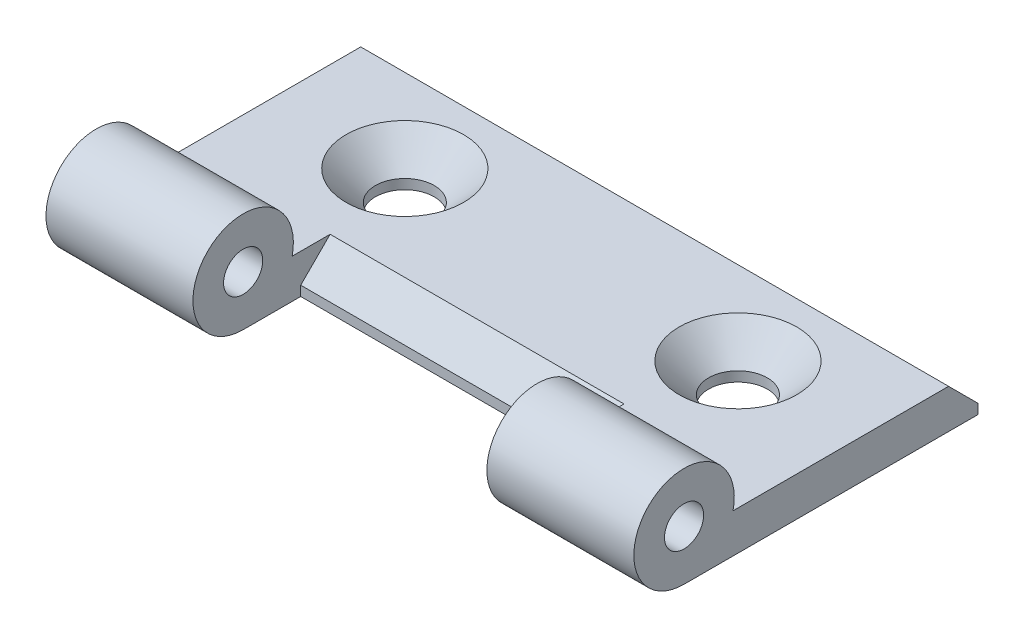
ISO-10303-21;
HEADER;
FILE_DESCRIPTION(('STEP AP214'),'2;1');
FILE_NAME('part.step','',(''),(''),'','','');
FILE_SCHEMA(('AUTOMOTIVE_DESIGN { 1 0 10303 214 1 1 1 1 }'));
ENDSEC;
DATA;
#1=APPLICATION_CONTEXT('core data for automotive mechanical design processes');
#2=APPLICATION_PROTOCOL_DEFINITION('international standard','automotive_design',2000,#1);
#3=PRODUCT_CONTEXT('',#1,'mechanical');
#4=PRODUCT('Part','Part','',(#3));
#5=PRODUCT_RELATED_PRODUCT_CATEGORY('part','',(#4));
#6=PRODUCT_DEFINITION_FORMATION('','',#4);
#7=PRODUCT_DEFINITION_CONTEXT('part definition',#1,'design');
#8=PRODUCT_DEFINITION('design','',#6,#7);
#9=PRODUCT_DEFINITION_SHAPE('','',#8);
#10=(LENGTH_UNIT() NAMED_UNIT(*) SI_UNIT(.MILLI.,.METRE.));
#11=(NAMED_UNIT(*) PLANE_ANGLE_UNIT() SI_UNIT($,.RADIAN.));
#12=(NAMED_UNIT(*) SI_UNIT($,.STERADIAN.) SOLID_ANGLE_UNIT());
#13=UNCERTAINTY_MEASURE_WITH_UNIT(LENGTH_MEASURE(1.E-05),#10,'distance_accuracy_value','');
#14=(GEOMETRIC_REPRESENTATION_CONTEXT(3) GLOBAL_UNCERTAINTY_ASSIGNED_CONTEXT((#13)) GLOBAL_UNIT_ASSIGNED_CONTEXT((#10,
#11,#12)) REPRESENTATION_CONTEXT('',''));
#15=CARTESIAN_POINT('',(0.,0.,0.));
#16=DIRECTION('',(0.,0.,1.));
#17=DIRECTION('',(1.,0.,0.));
#18=AXIS2_PLACEMENT_3D('',#15,#16,#17);
#19=CARTESIAN_POINT('',(30.,5.125,0.));
#20=DIRECTION('',(-1.,0.,0.));
#21=DIRECTION('',(0.,0.,1.));
#22=AXIS2_PLACEMENT_3D('',#19,#20,#21);
#23=CYLINDRICAL_SURFACE('',#22,5.125);
#24=CARTESIAN_POINT('',(-15.,5.125,0.));
#25=DIRECTION('',(1.,0.,0.));
#26=DIRECTION('',(0.,0.,-1.));
#27=AXIS2_PLACEMENT_3D('',#24,#25,#26);
#28=CIRCLE('',#27,5.125);
#29=CARTESIAN_POINT('',(-15.,4.,-5.));
#30=VERTEX_POINT('',#29);
#31=CARTESIAN_POINT('',(-15.,0.,0.));
#32=VERTEX_POINT('',#31);
#33=EDGE_CURVE('E159',#30,#32,#28,.T.);
#34=ORIENTED_EDGE('',*,*,#33,.F.);
#35=DIRECTION('',(-1.,0.,0.));
#36=VECTOR('',#35,1.);
#37=CARTESIAN_POINT('',(30.,4.,-5.));
#38=LINE('',#37,#36);
#39=CARTESIAN_POINT('',(-30.,4.,-5.));
#40=VERTEX_POINT('',#39);
#41=EDGE_CURVE('E178',#30,#40,#38,.T.);
#42=ORIENTED_EDGE('',*,*,#41,.T.);
#43=CARTESIAN_POINT('',(-30.,5.125,0.));
#44=DIRECTION('',(1.,0.,0.));
#45=DIRECTION('',(0.,0.,-1.));
#46=AXIS2_PLACEMENT_3D('',#43,#44,#45);
#47=CIRCLE('',#46,5.125);
#48=CARTESIAN_POINT('',(-30.,0.,0.));
#49=VERTEX_POINT('',#48);
#50=EDGE_CURVE('E165',#40,#49,#47,.T.);
#51=ORIENTED_EDGE('',*,*,#50,.T.);
#52=DIRECTION('',(-1.,0.,0.));
#53=VECTOR('',#52,1.);
#54=CARTESIAN_POINT('',(30.,0.,0.));
#55=LINE('',#54,#53);
#56=EDGE_CURVE('E192',#32,#49,#55,.T.);
#57=ORIENTED_EDGE('',*,*,#56,.F.);
#58=EDGE_LOOP('',(#34,#42,#51,#57));
#59=FACE_BOUND('',#58,.T.);
#60=ADVANCED_FACE('F37',(#59),#23,.T.);
#61=CARTESIAN_POINT('',(30.,4.,-5.));
#62=VERTEX_POINT('',#61);
#63=CARTESIAN_POINT('',(15.,4.,-5.));
#64=VERTEX_POINT('',#63);
#65=EDGE_CURVE('E186',#62,#64,#38,.T.);
#66=ORIENTED_EDGE('',*,*,#65,.T.);
#67=CARTESIAN_POINT('',(15.,5.125,0.));
#68=DIRECTION('',(-1.,0.,0.));
#69=DIRECTION('',(0.,0.,1.));
#70=AXIS2_PLACEMENT_3D('',#67,#68,#69);
#71=CIRCLE('',#70,5.125);
#72=CARTESIAN_POINT('',(15.,0.,0.));
#73=VERTEX_POINT('',#72);
#74=EDGE_CURVE('E153',#73,#64,#71,.T.);
#75=ORIENTED_EDGE('',*,*,#74,.F.);
#76=CARTESIAN_POINT('',(30.,0.,0.));
#77=VERTEX_POINT('',#76);
#78=EDGE_CURVE('E140',#77,#73,#55,.T.);
#79=ORIENTED_EDGE('',*,*,#78,.F.);
#80=CARTESIAN_POINT('',(30.,5.125,0.));
#81=DIRECTION('',(1.,0.,0.));
#82=DIRECTION('',(0.,0.,-1.));
#83=AXIS2_PLACEMENT_3D('',#80,#81,#82);
#84=CIRCLE('',#83,5.125);
#85=EDGE_CURVE('E168',#62,#77,#84,.T.);
#86=ORIENTED_EDGE('',*,*,#85,.F.);
#87=EDGE_LOOP('',(#66,#75,#79,#86));
#88=FACE_BOUND('',#87,.T.);
#89=ADVANCED_FACE('F250',(#88),#23,.T.);
#90=CARTESIAN_POINT('',(30.,5.125,0.));
#91=DIRECTION('',(-1.,0.,0.));
#92=DIRECTION('',(0.,0.,1.));
#93=AXIS2_PLACEMENT_3D('',#90,#91,#92);
#94=CYLINDRICAL_SURFACE('',#93,2.);
#95=CARTESIAN_POINT('',(-30.,5.125,0.));
#96=DIRECTION('',(1.,0.,0.));
#97=DIRECTION('',(0.,0.,-1.));
#98=AXIS2_PLACEMENT_3D('',#95,#96,#97);
#99=CIRCLE('',#98,2.);
#100=CARTESIAN_POINT('',(-30.,5.125,-2.));
#101=VERTEX_POINT('',#100);
#102=EDGE_CURVE('E161',#101,#101,#99,.T.);
#103=ORIENTED_EDGE('',*,*,#102,.F.);
#104=EDGE_LOOP('',(#103));
#105=FACE_BOUND('',#104,.T.);
#106=CARTESIAN_POINT('',(-15.,5.125,0.));
#107=DIRECTION('',(1.,0.,0.));
#108=DIRECTION('',(0.,0.,-1.));
#109=AXIS2_PLACEMENT_3D('',#106,#107,#108);
#110=CIRCLE('',#109,2.);
#111=CARTESIAN_POINT('',(-15.,5.125,-2.));
#112=VERTEX_POINT('',#111);
#113=EDGE_CURVE('E155',#112,#112,#110,.T.);
#114=ORIENTED_EDGE('',*,*,#113,.T.);
#115=EDGE_LOOP('',(#114));
#116=FACE_BOUND('',#115,.T.);
#117=ADVANCED_FACE('F252',(#105,#116),#94,.F.);
#118=CARTESIAN_POINT('',(30.,5.125,0.));
#119=DIRECTION('',(1.,0.,0.));
#120=DIRECTION('',(0.,0.,-1.));
#121=AXIS2_PLACEMENT_3D('',#118,#119,#120);
#122=CIRCLE('',#121,2.);
#123=CARTESIAN_POINT('',(30.,5.125,-2.));
#124=VERTEX_POINT('',#123);
#125=EDGE_CURVE('E162',#124,#124,#122,.T.);
#126=ORIENTED_EDGE('',*,*,#125,.T.);
#127=EDGE_LOOP('',(#126));
#128=FACE_BOUND('',#127,.T.);
#129=CARTESIAN_POINT('',(15.,5.125,0.));
#130=DIRECTION('',(-1.,0.,0.));
#131=DIRECTION('',(0.,0.,1.));
#132=AXIS2_PLACEMENT_3D('',#129,#130,#131);
#133=CIRCLE('',#132,2.);
#134=CARTESIAN_POINT('',(15.,5.125,2.));
#135=VERTEX_POINT('',#134);
#136=EDGE_CURVE('E150',#135,#135,#133,.T.);
#137=ORIENTED_EDGE('',*,*,#136,.T.);
#138=EDGE_LOOP('',(#137));
#139=FACE_BOUND('',#138,.T.);
#140=ADVANCED_FACE('F258',(#128,#139),#94,.F.);
#141=CARTESIAN_POINT('',(30.,5.125,0.));
#142=DIRECTION('',(1.,0.,0.));
#143=DIRECTION('',(0.,0.,-1.));
#144=AXIS2_PLACEMENT_3D('',#141,#142,#143);
#145=PLANE('',#144);
#146=DIRECTION('',(0.,1.,0.));
#147=VECTOR('',#146,1.);
#148=CARTESIAN_POINT('',(30.,0.,-30.));
#149=LINE('',#148,#147);
#150=CARTESIAN_POINT('',(30.,0.,-30.));
#151=VERTEX_POINT('',#150);
#152=CARTESIAN_POINT('',(30.,0.999999999999984,-30.));
#153=VERTEX_POINT('',#152);
#154=EDGE_CURVE('E174',#151,#153,#149,.T.);
#155=ORIENTED_EDGE('',*,*,#154,.T.);
#156=DIRECTION('',(0.,-0.707106781186549,-0.707106781186546));
#157=VECTOR('',#156,1.);
#158=CARTESIAN_POINT('',(30.,18.0625,-12.9375000000001));
#159=LINE('',#158,#157);
#160=CARTESIAN_POINT('',(30.,4.,-27.));
#161=VERTEX_POINT('',#160);
#162=EDGE_CURVE('E220',#153,#161,#159,.F.);
#163=ORIENTED_EDGE('',*,*,#162,.T.);
#164=DIRECTION('',(0.,0.,1.));
#165=VECTOR('',#164,1.);
#166=CARTESIAN_POINT('',(30.,4.,-5.));
#167=LINE('',#166,#165);
#168=EDGE_CURVE('E176',#161,#62,#167,.T.);
#169=ORIENTED_EDGE('',*,*,#168,.T.);
#170=ORIENTED_EDGE('',*,*,#85,.T.);
#171=DIRECTION('',(0.,0.,-1.));
#172=VECTOR('',#171,1.);
#173=CARTESIAN_POINT('',(30.,0.,0.));
#174=LINE('',#173,#172);
#175=EDGE_CURVE('E171',#77,#151,#174,.T.);
#176=ORIENTED_EDGE('',*,*,#175,.T.);
#177=EDGE_LOOP('',(#155,#163,#169,#170,#176));
#178=FACE_BOUND('',#177,.T.);
#179=ORIENTED_EDGE('',*,*,#125,.F.);
#180=EDGE_LOOP('',(#179));
#181=FACE_BOUND('',#180,.T.);
#182=ADVANCED_FACE('F243',(#178,#181),#145,.T.);
#183=CARTESIAN_POINT('',(-30.,5.125,0.));
#184=DIRECTION('',(1.,0.,0.));
#185=DIRECTION('',(0.,0.,-1.));
#186=AXIS2_PLACEMENT_3D('',#183,#184,#185);
#187=PLANE('',#186);
#188=DIRECTION('',(0.,0.,1.));
#189=VECTOR('',#188,1.);
#190=CARTESIAN_POINT('',(-30.,4.,-5.));
#191=LINE('',#190,#189);
#192=CARTESIAN_POINT('',(-30.,4.,-27.));
#193=VERTEX_POINT('',#192);
#194=EDGE_CURVE('E172',#193,#40,#191,.T.);
#195=ORIENTED_EDGE('',*,*,#194,.F.);
#196=DIRECTION('',(0.,0.707106781186549,0.707106781186546));
#197=VECTOR('',#196,1.);
#198=CARTESIAN_POINT('',(-30.,4.,-27.));
#199=LINE('',#198,#197);
#200=CARTESIAN_POINT('',(-30.,0.999999999999984,-30.));
#201=VERTEX_POINT('',#200);
#202=EDGE_CURVE('E61',#193,#201,#199,.F.);
#203=ORIENTED_EDGE('',*,*,#202,.T.);
#204=DIRECTION('',(0.,1.,0.));
#205=VECTOR('',#204,1.);
#206=CARTESIAN_POINT('',(-30.,0.,-30.));
#207=LINE('',#206,#205);
#208=CARTESIAN_POINT('',(-30.,0.,-30.));
#209=VERTEX_POINT('',#208);
#210=EDGE_CURVE('E183',#209,#201,#207,.T.);
#211=ORIENTED_EDGE('',*,*,#210,.F.);
#212=DIRECTION('',(0.,0.,-1.));
#213=VECTOR('',#212,1.);
#214=CARTESIAN_POINT('',(-30.,0.,0.));
#215=LINE('',#214,#213);
#216=EDGE_CURVE('E181',#49,#209,#215,.T.);
#217=ORIENTED_EDGE('',*,*,#216,.F.);
#218=ORIENTED_EDGE('',*,*,#50,.F.);
#219=EDGE_LOOP('',(#195,#203,#211,#217,#218));
#220=FACE_BOUND('',#219,.T.);
#221=ORIENTED_EDGE('',*,*,#102,.T.);
#222=EDGE_LOOP('',(#221));
#223=FACE_BOUND('',#222,.T.);
#224=ADVANCED_FACE('F237',(#220,#223),#187,.F.);
#225=CARTESIAN_POINT('',(30.,0.,0.));
#226=DIRECTION('',(0.,1.,0.));
#227=DIRECTION('',(0.,0.,1.));
#228=AXIS2_PLACEMENT_3D('',#225,#226,#227);
#229=PLANE('',#228);
#230=DIRECTION('',(0.,0.,1.));
#231=VECTOR('',#230,1.);
#232=CARTESIAN_POINT('',(-15.,0.,-5.875));
#233=LINE('',#232,#231);
#234=CARTESIAN_POINT('',(-15.,0.,-5.875));
#235=VERTEX_POINT('',#234);
#236=EDGE_CURVE('E141',#235,#32,#233,.T.);
#237=ORIENTED_EDGE('',*,*,#236,.T.);
#238=ORIENTED_EDGE('',*,*,#56,.T.);
#239=ORIENTED_EDGE('',*,*,#216,.T.);
#240=DIRECTION('',(-1.,0.,0.));
#241=VECTOR('',#240,1.);
#242=CARTESIAN_POINT('',(30.,0.,-30.));
#243=LINE('',#242,#241);
#244=EDGE_CURVE('E189',#151,#209,#243,.T.);
#245=ORIENTED_EDGE('',*,*,#244,.F.);
#246=ORIENTED_EDGE('',*,*,#175,.F.);
#247=ORIENTED_EDGE('',*,*,#78,.T.);
#248=DIRECTION('',(0.,0.,-1.));
#249=VECTOR('',#248,1.);
#250=CARTESIAN_POINT('',(15.,0.,-5.875));
#251=LINE('',#250,#249);
#252=CARTESIAN_POINT('',(15.,0.,-5.875));
#253=VERTEX_POINT('',#252);
#254=EDGE_CURVE('E119',#73,#253,#251,.T.);
#255=ORIENTED_EDGE('',*,*,#254,.T.);
#256=DIRECTION('',(-1.,0.,0.));
#257=VECTOR('',#256,1.);
#258=CARTESIAN_POINT('',(-15.,0.,-5.875));
#259=LINE('',#258,#257);
#260=EDGE_CURVE('E129',#253,#235,#259,.T.);
#261=ORIENTED_EDGE('',*,*,#260,.T.);
#262=EDGE_LOOP('',(#237,#238,#239,#245,#246,#247,#255,#261));
#263=FACE_BOUND('',#262,.T.);
#264=CARTESIAN_POINT('',(17.,0.,-18.5));
#265=DIRECTION('',(0.,1.,0.));
#266=DIRECTION('',(0.,0.,1.));
#267=AXIS2_PLACEMENT_3D('',#264,#265,#266);
#268=CIRCLE('',#267,3.);
#269=CARTESIAN_POINT('',(17.,0.,-15.5));
#270=VERTEX_POINT('',#269);
#271=EDGE_CURVE('E125',#270,#270,#268,.T.);
#272=ORIENTED_EDGE('',*,*,#271,.T.);
#273=EDGE_LOOP('',(#272));
#274=FACE_BOUND('',#273,.T.);
#275=CARTESIAN_POINT('',(-17.,0.,-18.5));
#276=DIRECTION('',(0.,1.,0.));
#277=DIRECTION('',(0.,0.,1.));
#278=AXIS2_PLACEMENT_3D('',#275,#276,#277);
#279=CIRCLE('',#278,3.);
#280=CARTESIAN_POINT('',(-17.,0.,-15.5));
#281=VERTEX_POINT('',#280);
#282=EDGE_CURVE('E147',#281,#281,#279,.T.);
#283=ORIENTED_EDGE('',*,*,#282,.T.);
#284=EDGE_LOOP('',(#283));
#285=FACE_BOUND('',#284,.T.);
#286=ADVANCED_FACE('F137',(#263,#274,#285),#229,.F.);
#287=CARTESIAN_POINT('',(30.,0.,-30.));
#288=DIRECTION('',(0.,0.,1.));
#289=DIRECTION('',(1.,0.,0.));
#290=AXIS2_PLACEMENT_3D('',#287,#288,#289);
#291=PLANE('',#290);
#292=ORIENTED_EDGE('',*,*,#210,.T.);
#293=DIRECTION('',(1.,0.,0.));
#294=VECTOR('',#293,1.);
#295=CARTESIAN_POINT('',(30.,0.999999999999984,-30.));
#296=LINE('',#295,#294);
#297=EDGE_CURVE('E53',#201,#153,#296,.T.);
#298=ORIENTED_EDGE('',*,*,#297,.T.);
#299=ORIENTED_EDGE('',*,*,#154,.F.);
#300=ORIENTED_EDGE('',*,*,#244,.T.);
#301=EDGE_LOOP('',(#292,#298,#299,#300));
#302=FACE_BOUND('',#301,.T.);
#303=ADVANCED_FACE('F240',(#302),#291,.F.);
#304=CARTESIAN_POINT('',(30.,4.,-5.));
#305=DIRECTION('',(0.,-1.,0.));
#306=DIRECTION('',(0.,0.,-1.));
#307=AXIS2_PLACEMENT_3D('',#304,#305,#306);
#308=PLANE('',#307);
#309=CARTESIAN_POINT('',(-17.,4.,-18.5));
#310=DIRECTION('',(0.,-1.,0.));
#311=DIRECTION('',(0.,0.,-1.));
#312=AXIS2_PLACEMENT_3D('',#309,#310,#311);
#313=CIRCLE('',#312,6.00000000000001);
#314=CARTESIAN_POINT('',(-17.,4.,-24.5));
#315=VERTEX_POINT('',#314);
#316=EDGE_CURVE('E210',#315,#315,#313,.T.);
#317=ORIENTED_EDGE('',*,*,#316,.T.);
#318=EDGE_LOOP('',(#317));
#319=FACE_BOUND('',#318,.T.);
#320=CARTESIAN_POINT('',(17.,4.,-18.5));
#321=DIRECTION('',(0.,-1.,0.));
#322=DIRECTION('',(0.,0.,-1.));
#323=AXIS2_PLACEMENT_3D('',#320,#321,#322);
#324=CIRCLE('',#323,6.00000000000001);
#325=CARTESIAN_POINT('',(17.,4.,-24.5));
#326=VERTEX_POINT('',#325);
#327=EDGE_CURVE('E204',#326,#326,#324,.T.);
#328=ORIENTED_EDGE('',*,*,#327,.T.);
#329=EDGE_LOOP('',(#328));
#330=FACE_BOUND('',#329,.T.);
#331=DIRECTION('',(0.,0.,1.));
#332=VECTOR('',#331,1.);
#333=CARTESIAN_POINT('',(-15.,4.,-5.));
#334=LINE('',#333,#332);
#335=CARTESIAN_POINT('',(-15.,4.,-8.87500000000002));
#336=VERTEX_POINT('',#335);
#337=EDGE_CURVE('E156',#336,#30,#334,.T.);
#338=ORIENTED_EDGE('',*,*,#337,.F.);
#339=DIRECTION('',(1.,0.,0.));
#340=VECTOR('',#339,1.);
#341=CARTESIAN_POINT('',(15.,4.,-8.87500000000002));
#342=LINE('',#341,#340);
#343=CARTESIAN_POINT('',(15.,4.,-8.87500000000002));
#344=VERTEX_POINT('',#343);
#345=EDGE_CURVE('E207',#336,#344,#342,.T.);
#346=ORIENTED_EDGE('',*,*,#345,.T.);
#347=DIRECTION('',(0.,0.,-1.));
#348=VECTOR('',#347,1.);
#349=CARTESIAN_POINT('',(15.,4.,-4.99999999999999));
#350=LINE('',#349,#348);
#351=EDGE_CURVE('E151',#64,#344,#350,.T.);
#352=ORIENTED_EDGE('',*,*,#351,.F.);
#353=ORIENTED_EDGE('',*,*,#65,.F.);
#354=ORIENTED_EDGE('',*,*,#168,.F.);
#355=DIRECTION('',(-1.,0.,0.));
#356=VECTOR('',#355,1.);
#357=CARTESIAN_POINT('',(30.,4.,-27.));
#358=LINE('',#357,#356);
#359=EDGE_CURVE('E201',#161,#193,#358,.T.);
#360=ORIENTED_EDGE('',*,*,#359,.T.);
#361=ORIENTED_EDGE('',*,*,#194,.T.);
#362=ORIENTED_EDGE('',*,*,#41,.F.);
#363=EDGE_LOOP('',(#338,#346,#352,#353,#354,#360,#361,#362));
#364=FACE_BOUND('',#363,.T.);
#365=ADVANCED_FACE('F230',(#319,#330,#364),#308,.F.);
#366=CARTESIAN_POINT('',(-15.,10.25,-5.875));
#367=DIRECTION('',(0.,0.,1.));
#368=DIRECTION('',(1.,0.,0.));
#369=AXIS2_PLACEMENT_3D('',#366,#367,#368);
#370=PLANE('',#369);
#371=DIRECTION('',(0.,-1.,0.));
#372=VECTOR('',#371,1.);
#373=CARTESIAN_POINT('',(15.,10.25,-5.875));
#374=LINE('',#373,#372);
#375=CARTESIAN_POINT('',(15.,0.999999999999997,-5.875));
#376=VERTEX_POINT('',#375);
#377=EDGE_CURVE('E115',#376,#253,#374,.T.);
#378=ORIENTED_EDGE('',*,*,#377,.F.);
#379=DIRECTION('',(-1.,0.,0.));
#380=VECTOR('',#379,1.);
#381=CARTESIAN_POINT('',(-15.,0.999999999999997,-5.875));
#382=LINE('',#381,#380);
#383=CARTESIAN_POINT('',(-15.,0.999999999999997,-5.875));
#384=VERTEX_POINT('',#383);
#385=EDGE_CURVE('E213',#376,#384,#382,.T.);
#386=ORIENTED_EDGE('',*,*,#385,.T.);
#387=DIRECTION('',(0.,-1.,0.));
#388=VECTOR('',#387,1.);
#389=CARTESIAN_POINT('',(-15.,10.25,-5.875));
#390=LINE('',#389,#388);
#391=EDGE_CURVE('E126',#384,#235,#390,.T.);
#392=ORIENTED_EDGE('',*,*,#391,.T.);
#393=ORIENTED_EDGE('',*,*,#260,.F.);
#394=EDGE_LOOP('',(#378,#386,#392,#393));
#395=FACE_BOUND('',#394,.T.);
#396=ADVANCED_FACE('F130',(#395),#370,.T.);
#397=CARTESIAN_POINT('',(-15.,10.25,-5.875));
#398=DIRECTION('',(1.,0.,0.));
#399=DIRECTION('',(0.,0.,-1.));
#400=AXIS2_PLACEMENT_3D('',#397,#398,#399);
#401=PLANE('',#400);
#402=ORIENTED_EDGE('',*,*,#113,.F.);
#403=EDGE_LOOP('',(#402));
#404=FACE_BOUND('',#403,.T.);
#405=ORIENTED_EDGE('',*,*,#33,.T.);
#406=ORIENTED_EDGE('',*,*,#236,.F.);
#407=ORIENTED_EDGE('',*,*,#391,.F.);
#408=DIRECTION('',(0.,0.707106781186546,-0.707106781186549));
#409=VECTOR('',#408,1.);
#410=CARTESIAN_POINT('',(-15.,0.999999999999997,-5.875));
#411=LINE('',#410,#409);
#412=EDGE_CURVE('E46',#384,#336,#411,.T.);
#413=ORIENTED_EDGE('',*,*,#412,.T.);
#414=ORIENTED_EDGE('',*,*,#337,.T.);
#415=EDGE_LOOP('',(#405,#406,#407,#413,#414));
#416=FACE_BOUND('',#415,.T.);
#417=ADVANCED_FACE('F224',(#404,#416),#401,.T.);
#418=CARTESIAN_POINT('',(15.,10.25,-5.875));
#419=DIRECTION('',(-1.,0.,0.));
#420=DIRECTION('',(0.,0.,1.));
#421=AXIS2_PLACEMENT_3D('',#418,#419,#420);
#422=PLANE('',#421);
#423=ORIENTED_EDGE('',*,*,#136,.F.);
#424=EDGE_LOOP('',(#423));
#425=FACE_BOUND('',#424,.T.);
#426=ORIENTED_EDGE('',*,*,#74,.T.);
#427=ORIENTED_EDGE('',*,*,#351,.T.);
#428=DIRECTION('',(0.,-0.707106781186546,0.707106781186549));
#429=VECTOR('',#428,1.);
#430=CARTESIAN_POINT('',(15.,1.,-5.87500000000001));
#431=LINE('',#430,#429);
#432=EDGE_CURVE('E11',#344,#376,#431,.T.);
#433=ORIENTED_EDGE('',*,*,#432,.T.);
#434=ORIENTED_EDGE('',*,*,#377,.T.);
#435=ORIENTED_EDGE('',*,*,#254,.F.);
#436=EDGE_LOOP('',(#426,#427,#433,#434,#435));
#437=FACE_BOUND('',#436,.T.);
#438=ADVANCED_FACE('F117',(#425,#437),#422,.T.);
#439=CARTESIAN_POINT('',(-17.,10.25,-18.5));
#440=DIRECTION('',(0.,-1.,0.));
#441=DIRECTION('',(0.,0.,-1.));
#442=AXIS2_PLACEMENT_3D('',#439,#440,#441);
#443=CYLINDRICAL_SURFACE('',#442,3.);
#444=CARTESIAN_POINT('',(-17.,1.,-18.5));
#445=DIRECTION('',(0.,-1.,0.));
#446=DIRECTION('',(0.,0.,-1.));
#447=AXIS2_PLACEMENT_3D('',#444,#445,#446);
#448=CIRCLE('',#447,3.);
#449=CARTESIAN_POINT('',(-17.,1.,-21.5));
#450=VERTEX_POINT('',#449);
#451=EDGE_CURVE('E194',#450,#450,#448,.F.);
#452=ORIENTED_EDGE('',*,*,#451,.T.);
#453=EDGE_LOOP('',(#452));
#454=FACE_BOUND('',#453,.T.);
#455=ORIENTED_EDGE('',*,*,#282,.F.);
#456=EDGE_LOOP('',(#455));
#457=FACE_BOUND('',#456,.T.);
#458=ADVANCED_FACE('F291',(#454,#457),#443,.F.);
#459=CARTESIAN_POINT('',(17.,10.25,-18.5));
#460=DIRECTION('',(0.,-1.,0.));
#461=DIRECTION('',(0.,0.,-1.));
#462=AXIS2_PLACEMENT_3D('',#459,#460,#461);
#463=CYLINDRICAL_SURFACE('',#462,3.);
#464=CARTESIAN_POINT('',(17.,1.00000000000001,-18.5));
#465=DIRECTION('',(0.,-1.,0.));
#466=DIRECTION('',(0.,0.,-1.));
#467=AXIS2_PLACEMENT_3D('',#464,#465,#466);
#468=CIRCLE('',#467,3.);
#469=CARTESIAN_POINT('',(17.,1.00000000000001,-21.5));
#470=VERTEX_POINT('',#469);
#471=EDGE_CURVE('E215',#470,#470,#468,.F.);
#472=ORIENTED_EDGE('',*,*,#471,.T.);
#473=EDGE_LOOP('',(#472));
#474=FACE_BOUND('',#473,.T.);
#475=ORIENTED_EDGE('',*,*,#271,.F.);
#476=EDGE_LOOP('',(#475));
#477=FACE_BOUND('',#476,.T.);
#478=ADVANCED_FACE('F271',(#474,#477),#463,.F.);
#479=CARTESIAN_POINT('',(-17.,1.,-18.5));
#480=DIRECTION('',(0.,1.,0.));
#481=DIRECTION('',(0.,0.,1.));
#482=AXIS2_PLACEMENT_3D('',#479,#480,#481);
#483=CONICAL_SURFACE('',#482,3.,0.785398163397451);
#484=ORIENTED_EDGE('',*,*,#316,.F.);
#485=EDGE_LOOP('',(#484));
#486=FACE_BOUND('',#485,.T.);
#487=ORIENTED_EDGE('',*,*,#451,.F.);
#488=EDGE_LOOP('',(#487));
#489=FACE_BOUND('',#488,.T.);
#490=ADVANCED_FACE('F265',(#486,#489),#483,.F.);
#491=CARTESIAN_POINT('',(-15.,0.999999999999997,-5.875));
#492=DIRECTION('',(0.,0.707106781186549,0.707106781186546));
#493=DIRECTION('',(1.,0.,0.));
#494=AXIS2_PLACEMENT_3D('',#491,#492,#493);
#495=PLANE('',#494);
#496=ORIENTED_EDGE('',*,*,#432,.F.);
#497=ORIENTED_EDGE('',*,*,#345,.F.);
#498=ORIENTED_EDGE('',*,*,#412,.F.);
#499=ORIENTED_EDGE('',*,*,#385,.F.);
#500=EDGE_LOOP('',(#496,#497,#498,#499));
#501=FACE_BOUND('',#500,.T.);
#502=ADVANCED_FACE('F227',(#501),#495,.T.);
#503=CARTESIAN_POINT('',(17.,1.00000000000001,-18.5));
#504=DIRECTION('',(0.,1.,0.));
#505=DIRECTION('',(0.,0.,1.));
#506=AXIS2_PLACEMENT_3D('',#503,#504,#505);
#507=CONICAL_SURFACE('',#506,3.,0.785398163397451);
#508=ORIENTED_EDGE('',*,*,#327,.F.);
#509=EDGE_LOOP('',(#508));
#510=FACE_BOUND('',#509,.T.);
#511=ORIENTED_EDGE('',*,*,#471,.F.);
#512=EDGE_LOOP('',(#511));
#513=FACE_BOUND('',#512,.T.);
#514=ADVANCED_FACE('F277',(#510,#513),#507,.F.);
#515=CARTESIAN_POINT('',(30.,4.,-27.));
#516=DIRECTION('',(0.,-0.707106781186546,0.707106781186549));
#517=DIRECTION('',(-1.,0.,0.));
#518=AXIS2_PLACEMENT_3D('',#515,#516,#517);
#519=PLANE('',#518);
#520=ORIENTED_EDGE('',*,*,#162,.F.);
#521=ORIENTED_EDGE('',*,*,#297,.F.);
#522=ORIENTED_EDGE('',*,*,#202,.F.);
#523=ORIENTED_EDGE('',*,*,#359,.F.);
#524=EDGE_LOOP('',(#520,#521,#522,#523));
#525=FACE_BOUND('',#524,.T.);
#526=ADVANCED_FACE('F40',(#525),#519,.F.);
#527=CLOSED_SHELL('',(#60,#89,#117,#140,#182,#224,#286,#303,#365,#396,#417,#438,#458,#478,#490,
#502,#514,#526));
#528=MANIFOLD_SOLID_BREP('B2',#527);
#529=ADVANCED_BREP_SHAPE_REPRESENTATION('',(#18,#528),#14);
#530=SHAPE_DEFINITION_REPRESENTATION(#9,#529);
ENDSEC;
END-ISO-10303-21;
